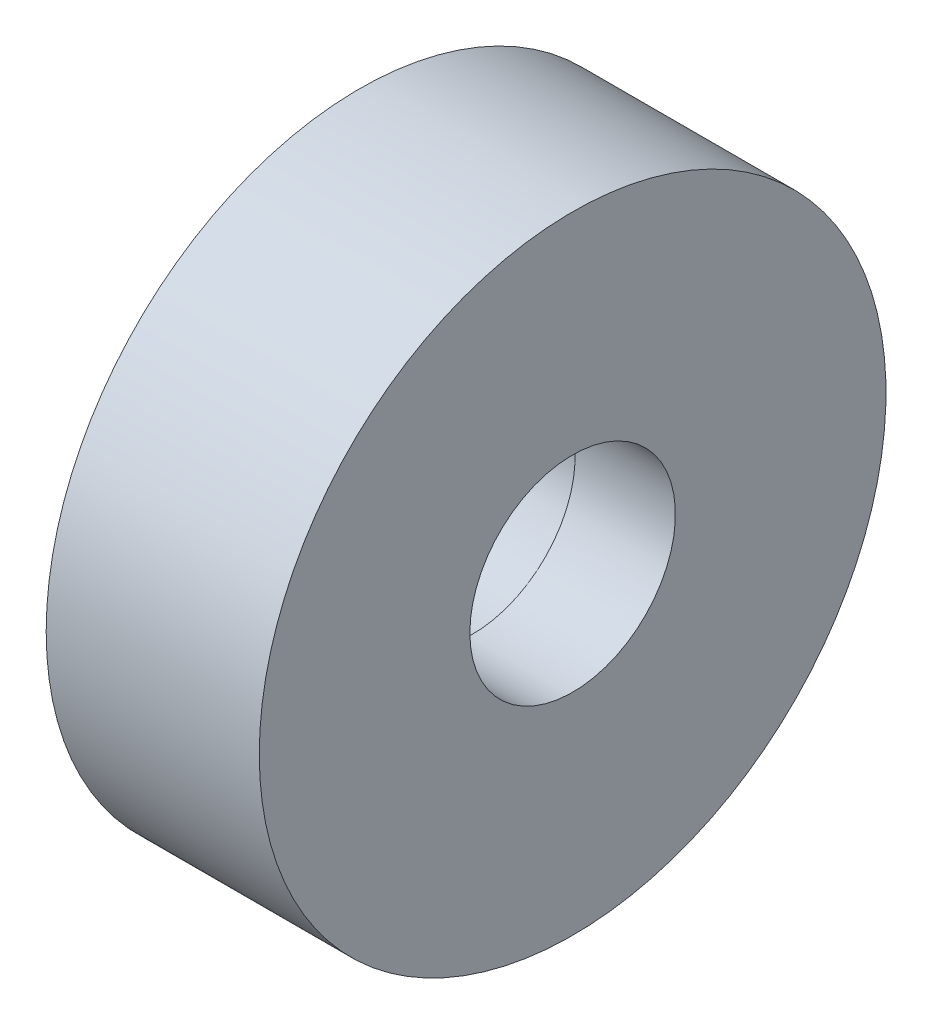
ISO-10303-21;
HEADER;
FILE_DESCRIPTION(('STEP AP214'),'2;1');
FILE_NAME('part.step','',(''),(''),'','','');
FILE_SCHEMA(('AUTOMOTIVE_DESIGN { 1 0 10303 214 1 1 1 1 }'));
ENDSEC;
DATA;
#1=APPLICATION_CONTEXT('core data for automotive mechanical design processes');
#2=APPLICATION_PROTOCOL_DEFINITION('international standard','automotive_design',2000,#1);
#3=PRODUCT_CONTEXT('',#1,'mechanical');
#4=PRODUCT('Part','Part','',(#3));
#5=PRODUCT_RELATED_PRODUCT_CATEGORY('part','',(#4));
#6=PRODUCT_DEFINITION_FORMATION('','',#4);
#7=PRODUCT_DEFINITION_CONTEXT('part definition',#1,'design');
#8=PRODUCT_DEFINITION('design','',#6,#7);
#9=PRODUCT_DEFINITION_SHAPE('','',#8);
#10=(LENGTH_UNIT() NAMED_UNIT(*) SI_UNIT(.MILLI.,.METRE.));
#11=(NAMED_UNIT(*) PLANE_ANGLE_UNIT() SI_UNIT($,.RADIAN.));
#12=(NAMED_UNIT(*) SI_UNIT($,.STERADIAN.) SOLID_ANGLE_UNIT());
#13=UNCERTAINTY_MEASURE_WITH_UNIT(LENGTH_MEASURE(1.E-05),#10,'distance_accuracy_value','');
#14=(GEOMETRIC_REPRESENTATION_CONTEXT(3) GLOBAL_UNCERTAINTY_ASSIGNED_CONTEXT((#13)) GLOBAL_UNIT_ASSIGNED_CONTEXT((#10,
#11,#12)) REPRESENTATION_CONTEXT('',''));
#15=CARTESIAN_POINT('',(0.,0.,0.));
#16=DIRECTION('',(0.,0.,1.));
#17=DIRECTION('',(1.,0.,0.));
#18=AXIS2_PLACEMENT_3D('',#15,#16,#17);
#19=CARTESIAN_POINT('',(4.25,4.1,0.));
#20=DIRECTION('',(-1.,0.,0.));
#21=DIRECTION('',(0.,0.,1.));
#22=AXIS2_PLACEMENT_3D('',#19,#20,#21);
#23=PLANE('',#22);
#24=CARTESIAN_POINT('',(4.25,0.,0.));
#25=DIRECTION('',(-1.,0.,0.));
#26=DIRECTION('',(0.,0.,1.));
#27=AXIS2_PLACEMENT_3D('',#24,#25,#26);
#28=CIRCLE('',#27,12.5);
#29=CARTESIAN_POINT('',(4.25,0.,12.5));
#30=VERTEX_POINT('',#29);
#31=EDGE_CURVE('E65',#30,#30,#28,.T.);
#32=ORIENTED_EDGE('',*,*,#31,.F.);
#33=EDGE_LOOP('',(#32));
#34=FACE_BOUND('',#33,.T.);
#35=CARTESIAN_POINT('',(4.25,0.,0.));
#36=DIRECTION('',(-1.,0.,0.));
#37=DIRECTION('',(0.,0.,1.));
#38=AXIS2_PLACEMENT_3D('',#35,#36,#37);
#39=CIRCLE('',#38,4.1);
#40=CARTESIAN_POINT('',(4.25,0.,4.1));
#41=VERTEX_POINT('',#40);
#42=EDGE_CURVE('E10',#41,#41,#39,.T.);
#43=ORIENTED_EDGE('',*,*,#42,.T.);
#44=EDGE_LOOP('',(#43));
#45=FACE_BOUND('',#44,.T.);
#46=ADVANCED_FACE('F38',(#34,#45),#23,.F.);
#47=CARTESIAN_POINT('',(0.,0.,0.));
#48=DIRECTION('',(-1.,0.,0.));
#49=DIRECTION('',(0.,0.,1.));
#50=AXIS2_PLACEMENT_3D('',#47,#48,#49);
#51=CYLINDRICAL_SURFACE('',#50,4.1);
#52=ORIENTED_EDGE('',*,*,#42,.F.);
#53=EDGE_LOOP('',(#52));
#54=FACE_BOUND('',#53,.T.);
#55=CARTESIAN_POINT('',(0.25,0.,0.));
#56=DIRECTION('',(-1.,0.,0.));
#57=DIRECTION('',(0.,0.,1.));
#58=AXIS2_PLACEMENT_3D('',#55,#56,#57);
#59=CIRCLE('',#58,4.1);
#60=CARTESIAN_POINT('',(0.25,0.,4.1));
#61=VERTEX_POINT('',#60);
#62=EDGE_CURVE('E45',#61,#61,#59,.T.);
#63=ORIENTED_EDGE('',*,*,#62,.T.);
#64=EDGE_LOOP('',(#63));
#65=FACE_BOUND('',#64,.T.);
#66=ADVANCED_FACE('F73',(#54,#65),#51,.F.);
#67=CARTESIAN_POINT('',(0.25,4.15,0.));
#68=DIRECTION('',(1.,0.,0.));
#69=DIRECTION('',(0.,0.,-1.));
#70=AXIS2_PLACEMENT_3D('',#67,#68,#69);
#71=PLANE('',#70);
#72=ORIENTED_EDGE('',*,*,#62,.F.);
#73=EDGE_LOOP('',(#72));
#74=FACE_BOUND('',#73,.T.);
#75=CARTESIAN_POINT('',(0.25,0.,0.));
#76=DIRECTION('',(-1.,0.,0.));
#77=DIRECTION('',(0.,0.,1.));
#78=AXIS2_PLACEMENT_3D('',#75,#76,#77);
#79=CIRCLE('',#78,4.15);
#80=CARTESIAN_POINT('',(0.25,0.,4.15));
#81=VERTEX_POINT('',#80);
#82=EDGE_CURVE('E50',#81,#81,#79,.T.);
#83=ORIENTED_EDGE('',*,*,#82,.T.);
#84=EDGE_LOOP('',(#83));
#85=FACE_BOUND('',#84,.T.);
#86=ADVANCED_FACE('F77',(#74,#85),#71,.F.);
#87=CARTESIAN_POINT('',(0.,0.,0.));
#88=DIRECTION('',(-1.,0.,0.));
#89=DIRECTION('',(0.,0.,1.));
#90=AXIS2_PLACEMENT_3D('',#87,#88,#89);
#91=CYLINDRICAL_SURFACE('',#90,4.15);
#92=ORIENTED_EDGE('',*,*,#82,.F.);
#93=EDGE_LOOP('',(#92));
#94=FACE_BOUND('',#93,.T.);
#95=CARTESIAN_POINT('',(-4.25,0.,0.));
#96=DIRECTION('',(-1.,0.,0.));
#97=DIRECTION('',(0.,0.,1.));
#98=AXIS2_PLACEMENT_3D('',#95,#96,#97);
#99=CIRCLE('',#98,4.15);
#100=CARTESIAN_POINT('',(-4.25,0.,4.15));
#101=VERTEX_POINT('',#100);
#102=EDGE_CURVE('E55',#101,#101,#99,.T.);
#103=ORIENTED_EDGE('',*,*,#102,.T.);
#104=EDGE_LOOP('',(#103));
#105=FACE_BOUND('',#104,.T.);
#106=ADVANCED_FACE('F82',(#94,#105),#91,.F.);
#107=CARTESIAN_POINT('',(-4.25,12.5,0.));
#108=DIRECTION('',(1.,0.,0.));
#109=DIRECTION('',(0.,0.,-1.));
#110=AXIS2_PLACEMENT_3D('',#107,#108,#109);
#111=PLANE('',#110);
#112=ORIENTED_EDGE('',*,*,#102,.F.);
#113=EDGE_LOOP('',(#112));
#114=FACE_BOUND('',#113,.T.);
#115=CARTESIAN_POINT('',(-4.25,0.,0.));
#116=DIRECTION('',(-1.,0.,0.));
#117=DIRECTION('',(0.,0.,1.));
#118=AXIS2_PLACEMENT_3D('',#115,#116,#117);
#119=CIRCLE('',#118,12.5);
#120=CARTESIAN_POINT('',(-4.25,0.,12.5));
#121=VERTEX_POINT('',#120);
#122=EDGE_CURVE('E61',#121,#121,#119,.T.);
#123=ORIENTED_EDGE('',*,*,#122,.T.);
#124=EDGE_LOOP('',(#123));
#125=FACE_BOUND('',#124,.T.);
#126=ADVANCED_FACE('F88',(#114,#125),#111,.F.);
#127=CARTESIAN_POINT('',(0.,0.,0.));
#128=DIRECTION('',(-1.,0.,0.));
#129=DIRECTION('',(0.,0.,1.));
#130=AXIS2_PLACEMENT_3D('',#127,#128,#129);
#131=CYLINDRICAL_SURFACE('',#130,12.5);
#132=ORIENTED_EDGE('',*,*,#122,.F.);
#133=EDGE_LOOP('',(#132));
#134=FACE_BOUND('',#133,.T.);
#135=ORIENTED_EDGE('',*,*,#31,.T.);
#136=EDGE_LOOP('',(#135));
#137=FACE_BOUND('',#136,.T.);
#138=ADVANCED_FACE('F70',(#134,#137),#131,.T.);
#139=CLOSED_SHELL('',(#46,#66,#86,#106,#126,#138));
#140=MANIFOLD_SOLID_BREP('B2',#139);
#141=ADVANCED_BREP_SHAPE_REPRESENTATION('',(#18,#140),#14);
#142=SHAPE_DEFINITION_REPRESENTATION(#9,#141);
ENDSEC;
END-ISO-10303-21;
